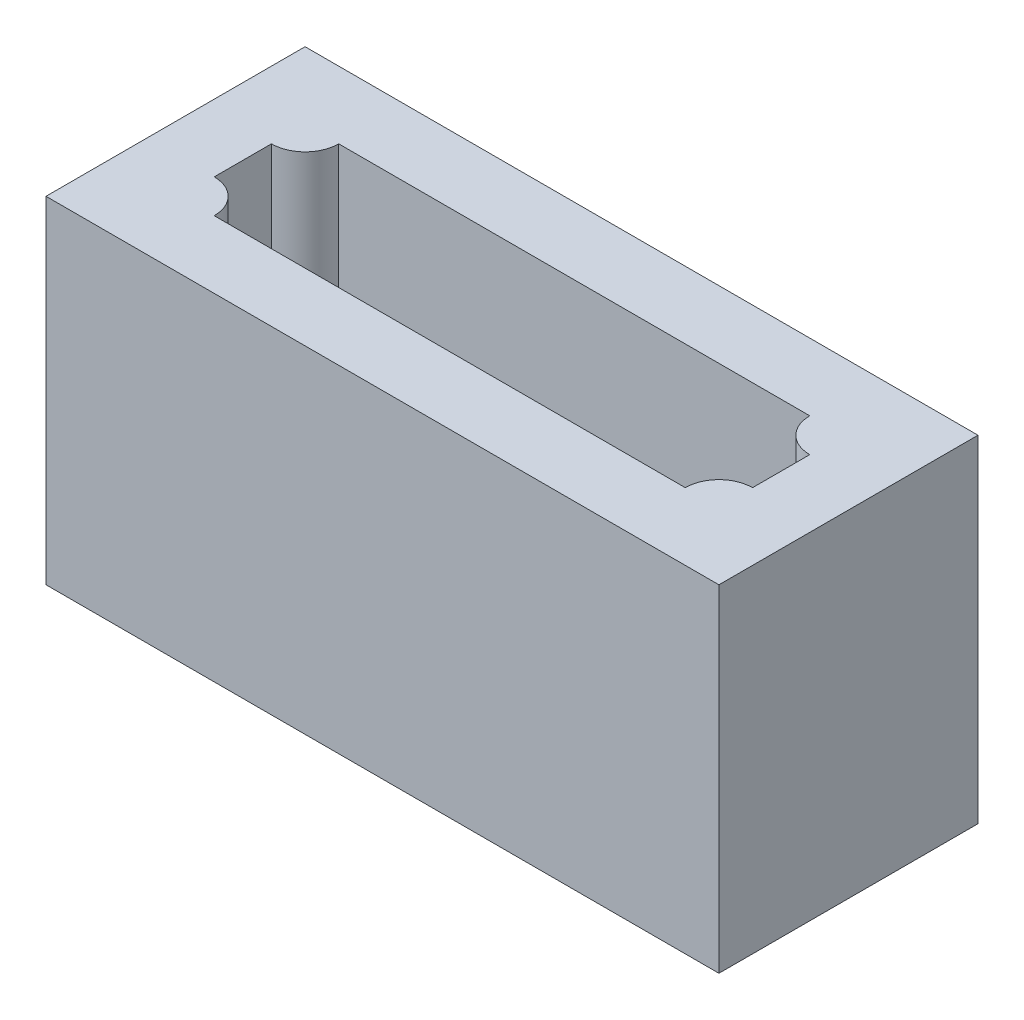
ISO-10303-21;
HEADER;
FILE_DESCRIPTION(('STEP AP214'),'2;1');
FILE_NAME('part.step','',(''),(''),'','','');
FILE_SCHEMA(('AUTOMOTIVE_DESIGN { 1 0 10303 214 1 1 1 1 }'));
ENDSEC;
DATA;
#1=APPLICATION_CONTEXT('core data for automotive mechanical design processes');
#2=APPLICATION_PROTOCOL_DEFINITION('international standard','automotive_design',2000,#1);
#3=PRODUCT_CONTEXT('',#1,'mechanical');
#4=PRODUCT('Part','Part','',(#3));
#5=PRODUCT_RELATED_PRODUCT_CATEGORY('part','',(#4));
#6=PRODUCT_DEFINITION_FORMATION('','',#4);
#7=PRODUCT_DEFINITION_CONTEXT('part definition',#1,'design');
#8=PRODUCT_DEFINITION('design','',#6,#7);
#9=PRODUCT_DEFINITION_SHAPE('','',#8);
#10=(LENGTH_UNIT() NAMED_UNIT(*) SI_UNIT(.MILLI.,.METRE.));
#11=(NAMED_UNIT(*) PLANE_ANGLE_UNIT() SI_UNIT($,.RADIAN.));
#12=(NAMED_UNIT(*) SI_UNIT($,.STERADIAN.) SOLID_ANGLE_UNIT());
#13=UNCERTAINTY_MEASURE_WITH_UNIT(LENGTH_MEASURE(1.E-05),#10,'distance_accuracy_value','');
#14=(GEOMETRIC_REPRESENTATION_CONTEXT(3) GLOBAL_UNCERTAINTY_ASSIGNED_CONTEXT((#13)) GLOBAL_UNIT_ASSIGNED_CONTEXT((#10,
#11,#12)) REPRESENTATION_CONTEXT('',''));
#15=CARTESIAN_POINT('',(0.,0.,0.));
#16=DIRECTION('',(0.,0.,1.));
#17=DIRECTION('',(1.,0.,0.));
#18=AXIS2_PLACEMENT_3D('',#15,#16,#17);
#19=CARTESIAN_POINT('',(-40.,-25.,-9.25));
#20=DIRECTION('',(-1.,0.,0.));
#21=DIRECTION('',(0.,0.,1.));
#22=AXIS2_PLACEMENT_3D('',#19,#20,#21);
#23=PLANE('',#22);
#24=DIRECTION('',(0.,-1.,0.));
#25=VECTOR('',#24,1.);
#26=CARTESIAN_POINT('',(-40.,25.,4.25));
#27=LINE('',#26,#25);
#28=CARTESIAN_POINT('',(-40.,-25.,4.25));
#29=VERTEX_POINT('',#28);
#30=CARTESIAN_POINT('',(-40.,25.,4.25));
#31=VERTEX_POINT('',#30);
#32=EDGE_CURVE('E128',#29,#31,#27,.F.);
#33=ORIENTED_EDGE('',*,*,#32,.F.);
#34=DIRECTION('',(0.,0.,1.));
#35=VECTOR('',#34,1.);
#36=CARTESIAN_POINT('',(-40.,-25.,-9.25));
#37=LINE('',#36,#35);
#38=CARTESIAN_POINT('',(-40.,-25.,-4.25000000000001));
#39=VERTEX_POINT('',#38);
#40=EDGE_CURVE('E168',#39,#29,#37,.T.);
#41=ORIENTED_EDGE('',*,*,#40,.F.);
#42=DIRECTION('',(0.,-1.,0.));
#43=VECTOR('',#42,1.);
#44=CARTESIAN_POINT('',(-40.,25.,-4.25000000000001));
#45=LINE('',#44,#43);
#46=CARTESIAN_POINT('',(-40.,25.,-4.25000000000001));
#47=VERTEX_POINT('',#46);
#48=EDGE_CURVE('E232',#47,#39,#45,.T.);
#49=ORIENTED_EDGE('',*,*,#48,.F.);
#50=DIRECTION('',(0.,0.,1.));
#51=VECTOR('',#50,1.);
#52=CARTESIAN_POINT('',(-40.,25.,-9.25));
#53=LINE('',#52,#51);
#54=EDGE_CURVE('E147',#47,#31,#53,.T.);
#55=ORIENTED_EDGE('',*,*,#54,.T.);
#56=EDGE_LOOP('',(#33,#41,#49,#55));
#57=FACE_BOUND('',#56,.T.);
#58=ADVANCED_FACE('F34',(#57),#23,.F.);
#59=CARTESIAN_POINT('',(-40.,-25.,9.25));
#60=DIRECTION('',(0.,0.,1.));
#61=DIRECTION('',(1.,0.,0.));
#62=AXIS2_PLACEMENT_3D('',#59,#60,#61);
#63=PLANE('',#62);
#64=DIRECTION('',(0.,-1.,0.));
#65=VECTOR('',#64,1.);
#66=CARTESIAN_POINT('',(-35.,25.,9.25));
#67=LINE('',#66,#65);
#68=CARTESIAN_POINT('',(-35.,25.,9.25));
#69=VERTEX_POINT('',#68);
#70=CARTESIAN_POINT('',(-35.,-25.,9.25));
#71=VERTEX_POINT('',#70);
#72=EDGE_CURVE('E125',#69,#71,#67,.T.);
#73=ORIENTED_EDGE('',*,*,#72,.F.);
#74=DIRECTION('',(1.,0.,0.));
#75=VECTOR('',#74,1.);
#76=CARTESIAN_POINT('',(-40.,25.,9.25));
#77=LINE('',#76,#75);
#78=CARTESIAN_POINT('',(35.,25.,9.25));
#79=VERTEX_POINT('',#78);
#80=EDGE_CURVE('E137',#69,#79,#77,.T.);
#81=ORIENTED_EDGE('',*,*,#80,.T.);
#82=DIRECTION('',(0.,-1.,0.));
#83=VECTOR('',#82,1.);
#84=CARTESIAN_POINT('',(35.,25.,9.25));
#85=LINE('',#84,#83);
#86=CARTESIAN_POINT('',(35.,-25.,9.25));
#87=VERTEX_POINT('',#86);
#88=EDGE_CURVE('E246',#87,#79,#85,.F.);
#89=ORIENTED_EDGE('',*,*,#88,.F.);
#90=DIRECTION('',(1.,0.,0.));
#91=VECTOR('',#90,1.);
#92=CARTESIAN_POINT('',(-40.,-25.,9.25));
#93=LINE('',#92,#91);
#94=EDGE_CURVE('E139',#71,#87,#93,.T.);
#95=ORIENTED_EDGE('',*,*,#94,.F.);
#96=EDGE_LOOP('',(#73,#81,#89,#95));
#97=FACE_BOUND('',#96,.T.);
#98=ADVANCED_FACE('F135',(#97),#63,.F.);
#99=CARTESIAN_POINT('',(-40.,-25.,-9.25));
#100=DIRECTION('',(0.,0.,-1.));
#101=DIRECTION('',(-1.,0.,0.));
#102=AXIS2_PLACEMENT_3D('',#99,#100,#101);
#103=PLANE('',#102);
#104=DIRECTION('',(0.,-1.,0.));
#105=VECTOR('',#104,1.);
#106=CARTESIAN_POINT('',(-35.,25.,-9.25));
#107=LINE('',#106,#105);
#108=CARTESIAN_POINT('',(-35.,-25.,-9.25));
#109=VERTEX_POINT('',#108);
#110=CARTESIAN_POINT('',(-35.,25.,-9.25));
#111=VERTEX_POINT('',#110);
#112=EDGE_CURVE('E240',#109,#111,#107,.F.);
#113=ORIENTED_EDGE('',*,*,#112,.F.);
#114=DIRECTION('',(-1.,0.,0.));
#115=VECTOR('',#114,1.);
#116=CARTESIAN_POINT('',(-40.,-25.,-9.25));
#117=LINE('',#116,#115);
#118=CARTESIAN_POINT('',(35.,-25.,-9.25));
#119=VERTEX_POINT('',#118);
#120=EDGE_CURVE('E166',#119,#109,#117,.T.);
#121=ORIENTED_EDGE('',*,*,#120,.F.);
#122=DIRECTION('',(0.,-1.,0.));
#123=VECTOR('',#122,1.);
#124=CARTESIAN_POINT('',(35.,25.,-9.25));
#125=LINE('',#124,#123);
#126=CARTESIAN_POINT('',(35.,25.,-9.25));
#127=VERTEX_POINT('',#126);
#128=EDGE_CURVE('E256',#127,#119,#125,.T.);
#129=ORIENTED_EDGE('',*,*,#128,.F.);
#130=DIRECTION('',(-1.,0.,0.));
#131=VECTOR('',#130,1.);
#132=CARTESIAN_POINT('',(-40.,25.,-9.25));
#133=LINE('',#132,#131);
#134=EDGE_CURVE('E152',#127,#111,#133,.T.);
#135=ORIENTED_EDGE('',*,*,#134,.T.);
#136=EDGE_LOOP('',(#113,#121,#129,#135));
#137=FACE_BOUND('',#136,.T.);
#138=ADVANCED_FACE('F214',(#137),#103,.F.);
#139=CARTESIAN_POINT('',(40.,-25.,-9.25));
#140=DIRECTION('',(1.,0.,0.));
#141=DIRECTION('',(0.,0.,-1.));
#142=AXIS2_PLACEMENT_3D('',#139,#140,#141);
#143=PLANE('',#142);
#144=DIRECTION('',(0.,-1.,0.));
#145=VECTOR('',#144,1.);
#146=CARTESIAN_POINT('',(40.,25.,4.25));
#147=LINE('',#146,#145);
#148=CARTESIAN_POINT('',(40.,25.,4.25));
#149=VERTEX_POINT('',#148);
#150=CARTESIAN_POINT('',(40.,-25.,4.25));
#151=VERTEX_POINT('',#150);
#152=EDGE_CURVE('E248',#149,#151,#147,.T.);
#153=ORIENTED_EDGE('',*,*,#152,.F.);
#154=DIRECTION('',(0.,0.,-1.));
#155=VECTOR('',#154,1.);
#156=CARTESIAN_POINT('',(40.,25.,-9.25));
#157=LINE('',#156,#155);
#158=CARTESIAN_POINT('',(40.,25.,-4.25000000000001));
#159=VERTEX_POINT('',#158);
#160=EDGE_CURVE('E262',#149,#159,#157,.T.);
#161=ORIENTED_EDGE('',*,*,#160,.T.);
#162=DIRECTION('',(0.,-1.,0.));
#163=VECTOR('',#162,1.);
#164=CARTESIAN_POINT('',(40.,25.,-4.25000000000001));
#165=LINE('',#164,#163);
#166=CARTESIAN_POINT('',(40.,-25.,-4.25000000000001));
#167=VERTEX_POINT('',#166);
#168=EDGE_CURVE('E259',#167,#159,#165,.F.);
#169=ORIENTED_EDGE('',*,*,#168,.F.);
#170=DIRECTION('',(0.,0.,-1.));
#171=VECTOR('',#170,1.);
#172=CARTESIAN_POINT('',(40.,-25.,-9.25));
#173=LINE('',#172,#171);
#174=EDGE_CURVE('E164',#151,#167,#173,.T.);
#175=ORIENTED_EDGE('',*,*,#174,.F.);
#176=EDGE_LOOP('',(#153,#161,#169,#175));
#177=FACE_BOUND('',#176,.T.);
#178=ADVANCED_FACE('F220',(#177),#143,.F.);
#179=CARTESIAN_POINT('',(-50.,-25.,-19.25));
#180=DIRECTION('',(-1.,0.,0.));
#181=DIRECTION('',(0.,0.,1.));
#182=AXIS2_PLACEMENT_3D('',#179,#180,#181);
#183=PLANE('',#182);
#184=DIRECTION('',(0.,1.,0.));
#185=VECTOR('',#184,1.);
#186=CARTESIAN_POINT('',(-50.,-25.,19.25));
#187=LINE('',#186,#185);
#188=CARTESIAN_POINT('',(-50.,-25.,19.25));
#189=VERTEX_POINT('',#188);
#190=CARTESIAN_POINT('',(-50.,25.,19.25));
#191=VERTEX_POINT('',#190);
#192=EDGE_CURVE('E38',#189,#191,#187,.T.);
#193=ORIENTED_EDGE('',*,*,#192,.T.);
#194=DIRECTION('',(0.,0.,1.));
#195=VECTOR('',#194,1.);
#196=CARTESIAN_POINT('',(-50.,25.,-19.25));
#197=LINE('',#196,#195);
#198=CARTESIAN_POINT('',(-50.,25.,-19.25));
#199=VERTEX_POINT('',#198);
#200=EDGE_CURVE('E146',#199,#191,#197,.T.);
#201=ORIENTED_EDGE('',*,*,#200,.F.);
#202=DIRECTION('',(0.,1.,0.));
#203=VECTOR('',#202,1.);
#204=CARTESIAN_POINT('',(-50.,-25.,-19.25));
#205=LINE('',#204,#203);
#206=CARTESIAN_POINT('',(-50.,-25.,-19.25));
#207=VERTEX_POINT('',#206);
#208=EDGE_CURVE('E11',#207,#199,#205,.T.);
#209=ORIENTED_EDGE('',*,*,#208,.F.);
#210=DIRECTION('',(0.,0.,1.));
#211=VECTOR('',#210,1.);
#212=CARTESIAN_POINT('',(-50.,-25.,-19.25));
#213=LINE('',#212,#211);
#214=EDGE_CURVE('E171',#207,#189,#213,.T.);
#215=ORIENTED_EDGE('',*,*,#214,.T.);
#216=EDGE_LOOP('',(#193,#201,#209,#215));
#217=FACE_BOUND('',#216,.T.);
#218=ADVANCED_FACE('F36',(#217),#183,.T.);
#219=CARTESIAN_POINT('',(-50.,-25.,-19.25));
#220=DIRECTION('',(0.,0.,-1.));
#221=DIRECTION('',(-1.,0.,0.));
#222=AXIS2_PLACEMENT_3D('',#219,#220,#221);
#223=PLANE('',#222);
#224=ORIENTED_EDGE('',*,*,#208,.T.);
#225=DIRECTION('',(-1.,0.,0.));
#226=VECTOR('',#225,1.);
#227=CARTESIAN_POINT('',(-50.,25.,-19.25));
#228=LINE('',#227,#226);
#229=CARTESIAN_POINT('',(50.,25.,-19.25));
#230=VERTEX_POINT('',#229);
#231=EDGE_CURVE('E161',#230,#199,#228,.T.);
#232=ORIENTED_EDGE('',*,*,#231,.F.);
#233=DIRECTION('',(0.,1.,0.));
#234=VECTOR('',#233,1.);
#235=CARTESIAN_POINT('',(50.,-25.,-19.25));
#236=LINE('',#235,#234);
#237=CARTESIAN_POINT('',(50.,-25.,-19.25));
#238=VERTEX_POINT('',#237);
#239=EDGE_CURVE('E43',#238,#230,#236,.T.);
#240=ORIENTED_EDGE('',*,*,#239,.F.);
#241=DIRECTION('',(-1.,0.,0.));
#242=VECTOR('',#241,1.);
#243=CARTESIAN_POINT('',(-50.,-25.,-19.25));
#244=LINE('',#243,#242);
#245=EDGE_CURVE('E180',#238,#207,#244,.T.);
#246=ORIENTED_EDGE('',*,*,#245,.T.);
#247=EDGE_LOOP('',(#224,#232,#240,#246));
#248=FACE_BOUND('',#247,.T.);
#249=ADVANCED_FACE('F194',(#248),#223,.T.);
#250=CARTESIAN_POINT('',(50.,-25.,-19.25));
#251=DIRECTION('',(1.,0.,0.));
#252=DIRECTION('',(0.,0.,-1.));
#253=AXIS2_PLACEMENT_3D('',#250,#251,#252);
#254=PLANE('',#253);
#255=ORIENTED_EDGE('',*,*,#239,.T.);
#256=DIRECTION('',(0.,0.,-1.));
#257=VECTOR('',#256,1.);
#258=CARTESIAN_POINT('',(50.,25.,-19.25));
#259=LINE('',#258,#257);
#260=CARTESIAN_POINT('',(50.,25.,19.25));
#261=VERTEX_POINT('',#260);
#262=EDGE_CURVE('E158',#261,#230,#259,.T.);
#263=ORIENTED_EDGE('',*,*,#262,.F.);
#264=DIRECTION('',(0.,1.,0.));
#265=VECTOR('',#264,1.);
#266=CARTESIAN_POINT('',(50.,-25.,19.25));
#267=LINE('',#266,#265);
#268=CARTESIAN_POINT('',(50.,-25.,19.25));
#269=VERTEX_POINT('',#268);
#270=EDGE_CURVE('E183',#269,#261,#267,.T.);
#271=ORIENTED_EDGE('',*,*,#270,.F.);
#272=DIRECTION('',(0.,0.,-1.));
#273=VECTOR('',#272,1.);
#274=CARTESIAN_POINT('',(50.,-25.,-19.25));
#275=LINE('',#274,#273);
#276=EDGE_CURVE('E177',#269,#238,#275,.T.);
#277=ORIENTED_EDGE('',*,*,#276,.T.);
#278=EDGE_LOOP('',(#255,#263,#271,#277));
#279=FACE_BOUND('',#278,.T.);
#280=ADVANCED_FACE('F200',(#279),#254,.T.);
#281=CARTESIAN_POINT('',(-50.,-25.,19.25));
#282=DIRECTION('',(0.,0.,1.));
#283=DIRECTION('',(1.,0.,0.));
#284=AXIS2_PLACEMENT_3D('',#281,#282,#283);
#285=PLANE('',#284);
#286=ORIENTED_EDGE('',*,*,#270,.T.);
#287=DIRECTION('',(1.,0.,0.));
#288=VECTOR('',#287,1.);
#289=CARTESIAN_POINT('',(-50.,25.,19.25));
#290=LINE('',#289,#288);
#291=EDGE_CURVE('E150',#191,#261,#290,.T.);
#292=ORIENTED_EDGE('',*,*,#291,.F.);
#293=ORIENTED_EDGE('',*,*,#192,.F.);
#294=DIRECTION('',(1.,0.,0.));
#295=VECTOR('',#294,1.);
#296=CARTESIAN_POINT('',(-50.,-25.,19.25));
#297=LINE('',#296,#295);
#298=EDGE_CURVE('E174',#189,#269,#297,.T.);
#299=ORIENTED_EDGE('',*,*,#298,.T.);
#300=EDGE_LOOP('',(#286,#292,#293,#299));
#301=FACE_BOUND('',#300,.T.);
#302=ADVANCED_FACE('F190',(#301),#285,.T.);
#303=CARTESIAN_POINT('',(0.,-25.,0.));
#304=DIRECTION('',(0.,1.,0.));
#305=DIRECTION('',(0.,0.,1.));
#306=AXIS2_PLACEMENT_3D('',#303,#304,#305);
#307=PLANE('',#306);
#308=ORIENTED_EDGE('',*,*,#40,.T.);
#309=CARTESIAN_POINT('',(-40.,-25.,9.25));
#310=DIRECTION('',(0.,1.,0.));
#311=DIRECTION('',(0.,0.,1.));
#312=AXIS2_PLACEMENT_3D('',#309,#310,#311);
#313=CIRCLE('',#312,5.);
#314=EDGE_CURVE('E51',#71,#29,#313,.T.);
#315=ORIENTED_EDGE('',*,*,#314,.F.);
#316=ORIENTED_EDGE('',*,*,#94,.T.);
#317=CARTESIAN_POINT('',(40.,-25.,9.25));
#318=DIRECTION('',(0.,1.,0.));
#319=DIRECTION('',(0.,0.,1.));
#320=AXIS2_PLACEMENT_3D('',#317,#318,#319);
#321=CIRCLE('',#320,5.);
#322=EDGE_CURVE('E242',#151,#87,#321,.T.);
#323=ORIENTED_EDGE('',*,*,#322,.F.);
#324=ORIENTED_EDGE('',*,*,#174,.T.);
#325=CARTESIAN_POINT('',(40.,-25.,-9.25));
#326=DIRECTION('',(0.,1.,0.));
#327=DIRECTION('',(0.,0.,1.));
#328=AXIS2_PLACEMENT_3D('',#325,#326,#327);
#329=CIRCLE('',#328,5.);
#330=EDGE_CURVE('E250',#119,#167,#329,.T.);
#331=ORIENTED_EDGE('',*,*,#330,.F.);
#332=ORIENTED_EDGE('',*,*,#120,.T.);
#333=CARTESIAN_POINT('',(-40.,-25.,-9.25));
#334=DIRECTION('',(0.,1.,0.));
#335=DIRECTION('',(0.,0.,1.));
#336=AXIS2_PLACEMENT_3D('',#333,#334,#335);
#337=CIRCLE('',#336,5.);
#338=EDGE_CURVE('E57',#39,#109,#337,.T.);
#339=ORIENTED_EDGE('',*,*,#338,.F.);
#340=EDGE_LOOP('',(#308,#315,#316,#323,#324,#331,#332,#339));
#341=FACE_BOUND('',#340,.T.);
#342=ORIENTED_EDGE('',*,*,#214,.F.);
#343=ORIENTED_EDGE('',*,*,#245,.F.);
#344=ORIENTED_EDGE('',*,*,#276,.F.);
#345=ORIENTED_EDGE('',*,*,#298,.F.);
#346=EDGE_LOOP('',(#342,#343,#344,#345));
#347=FACE_BOUND('',#346,.T.);
#348=ADVANCED_FACE('F197',(#341,#347),#307,.F.);
#349=CARTESIAN_POINT('',(0.,25.,0.));
#350=DIRECTION('',(0.,1.,0.));
#351=DIRECTION('',(0.,0.,1.));
#352=AXIS2_PLACEMENT_3D('',#349,#350,#351);
#353=PLANE('',#352);
#354=ORIENTED_EDGE('',*,*,#80,.F.);
#355=CARTESIAN_POINT('',(-40.,25.,9.25));
#356=DIRECTION('',(0.,1.,0.));
#357=DIRECTION('',(0.,0.,1.));
#358=AXIS2_PLACEMENT_3D('',#355,#356,#357);
#359=CIRCLE('',#358,5.);
#360=EDGE_CURVE('E122',#69,#31,#359,.T.);
#361=ORIENTED_EDGE('',*,*,#360,.T.);
#362=ORIENTED_EDGE('',*,*,#54,.F.);
#363=CARTESIAN_POINT('',(-40.,25.,-9.25));
#364=DIRECTION('',(0.,1.,0.));
#365=DIRECTION('',(0.,0.,1.));
#366=AXIS2_PLACEMENT_3D('',#363,#364,#365);
#367=CIRCLE('',#366,5.);
#368=EDGE_CURVE('E234',#47,#111,#367,.T.);
#369=ORIENTED_EDGE('',*,*,#368,.T.);
#370=ORIENTED_EDGE('',*,*,#134,.F.);
#371=CARTESIAN_POINT('',(40.,25.,-9.25));
#372=DIRECTION('',(0.,1.,0.));
#373=DIRECTION('',(0.,0.,1.));
#374=AXIS2_PLACEMENT_3D('',#371,#372,#373);
#375=CIRCLE('',#374,5.);
#376=EDGE_CURVE('E253',#127,#159,#375,.T.);
#377=ORIENTED_EDGE('',*,*,#376,.T.);
#378=ORIENTED_EDGE('',*,*,#160,.F.);
#379=CARTESIAN_POINT('',(40.,25.,9.25));
#380=DIRECTION('',(0.,1.,0.));
#381=DIRECTION('',(0.,0.,1.));
#382=AXIS2_PLACEMENT_3D('',#379,#380,#381);
#383=CIRCLE('',#382,5.);
#384=EDGE_CURVE('E145',#149,#79,#383,.T.);
#385=ORIENTED_EDGE('',*,*,#384,.T.);
#386=EDGE_LOOP('',(#354,#361,#362,#369,#370,#377,#378,#385));
#387=FACE_BOUND('',#386,.T.);
#388=ORIENTED_EDGE('',*,*,#200,.T.);
#389=ORIENTED_EDGE('',*,*,#291,.T.);
#390=ORIENTED_EDGE('',*,*,#262,.T.);
#391=ORIENTED_EDGE('',*,*,#231,.T.);
#392=EDGE_LOOP('',(#388,#389,#390,#391));
#393=FACE_BOUND('',#392,.T.);
#394=ADVANCED_FACE('F142',(#387,#393),#353,.T.);
#395=CARTESIAN_POINT('',(40.,25.,-9.25));
#396=DIRECTION('',(0.,-1.,0.));
#397=DIRECTION('',(0.,0.,-1.));
#398=AXIS2_PLACEMENT_3D('',#395,#396,#397);
#399=CYLINDRICAL_SURFACE('',#398,5.);
#400=ORIENTED_EDGE('',*,*,#330,.T.);
#401=ORIENTED_EDGE('',*,*,#168,.T.);
#402=ORIENTED_EDGE('',*,*,#376,.F.);
#403=ORIENTED_EDGE('',*,*,#128,.T.);
#404=EDGE_LOOP('',(#400,#401,#402,#403));
#405=FACE_BOUND('',#404,.T.);
#406=ADVANCED_FACE('F229',(#405),#399,.T.);
#407=CARTESIAN_POINT('',(40.,25.,9.25));
#408=DIRECTION('',(0.,-1.,0.));
#409=DIRECTION('',(0.,0.,-1.));
#410=AXIS2_PLACEMENT_3D('',#407,#408,#409);
#411=CYLINDRICAL_SURFACE('',#410,5.);
#412=ORIENTED_EDGE('',*,*,#384,.F.);
#413=ORIENTED_EDGE('',*,*,#152,.T.);
#414=ORIENTED_EDGE('',*,*,#322,.T.);
#415=ORIENTED_EDGE('',*,*,#88,.T.);
#416=EDGE_LOOP('',(#412,#413,#414,#415));
#417=FACE_BOUND('',#416,.T.);
#418=ADVANCED_FACE('F271',(#417),#411,.T.);
#419=CARTESIAN_POINT('',(-40.,25.,-9.25));
#420=DIRECTION('',(0.,-1.,0.));
#421=DIRECTION('',(0.,0.,-1.));
#422=AXIS2_PLACEMENT_3D('',#419,#420,#421);
#423=CYLINDRICAL_SURFACE('',#422,5.);
#424=ORIENTED_EDGE('',*,*,#338,.T.);
#425=ORIENTED_EDGE('',*,*,#112,.T.);
#426=ORIENTED_EDGE('',*,*,#368,.F.);
#427=ORIENTED_EDGE('',*,*,#48,.T.);
#428=EDGE_LOOP('',(#424,#425,#426,#427));
#429=FACE_BOUND('',#428,.T.);
#430=ADVANCED_FACE('F269',(#429),#423,.T.);
#431=CARTESIAN_POINT('',(-40.,25.,9.25));
#432=DIRECTION('',(0.,-1.,0.));
#433=DIRECTION('',(0.,0.,-1.));
#434=AXIS2_PLACEMENT_3D('',#431,#432,#433);
#435=CYLINDRICAL_SURFACE('',#434,5.);
#436=ORIENTED_EDGE('',*,*,#314,.T.);
#437=ORIENTED_EDGE('',*,*,#32,.T.);
#438=ORIENTED_EDGE('',*,*,#360,.F.);
#439=ORIENTED_EDGE('',*,*,#72,.T.);
#440=EDGE_LOOP('',(#436,#437,#438,#439));
#441=FACE_BOUND('',#440,.T.);
#442=ADVANCED_FACE('F124',(#441),#435,.T.);
#443=CLOSED_SHELL('',(#58,#98,#138,#178,#218,#249,#280,#302,#348,#394,#406,#418,#430,#442));
#444=MANIFOLD_SOLID_BREP('B2',#443);
#445=ADVANCED_BREP_SHAPE_REPRESENTATION('',(#18,#444),#14);
#446=SHAPE_DEFINITION_REPRESENTATION(#9,#445);
ENDSEC;
END-ISO-10303-21;
